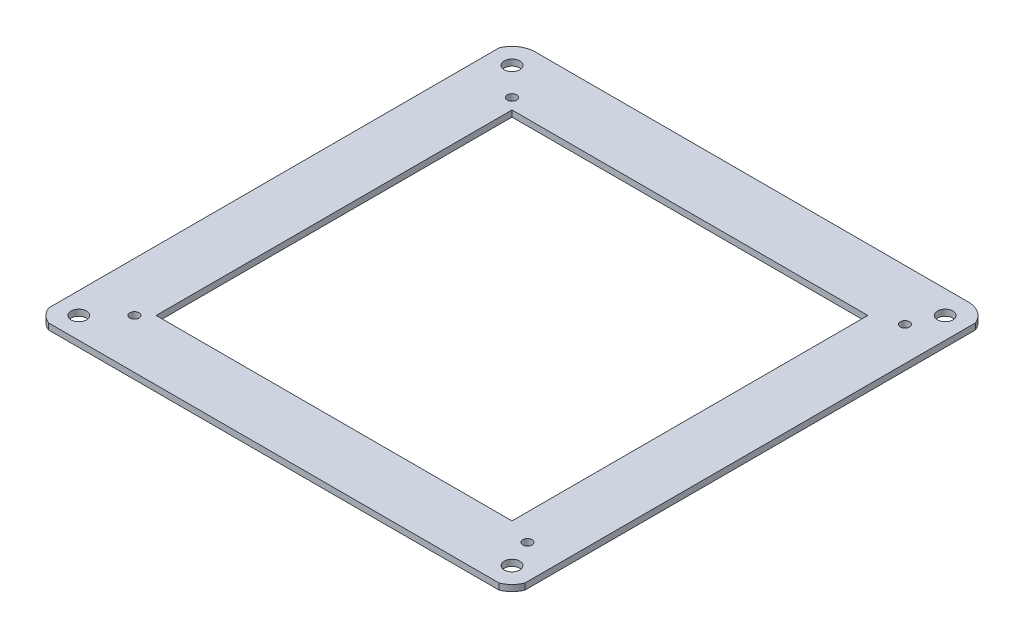
ISO-10303-21;
HEADER;
FILE_DESCRIPTION(('STEP AP214'),'2;1');
FILE_NAME('part.step','',(''),(''),'','','');
FILE_SCHEMA(('AUTOMOTIVE_DESIGN { 1 0 10303 214 1 1 1 1 }'));
ENDSEC;
DATA;
#1=APPLICATION_CONTEXT('core data for automotive mechanical design processes');
#2=APPLICATION_PROTOCOL_DEFINITION('international standard','automotive_design',2000,#1);
#3=PRODUCT_CONTEXT('',#1,'mechanical');
#4=PRODUCT('Part','Part','',(#3));
#5=PRODUCT_RELATED_PRODUCT_CATEGORY('part','',(#4));
#6=PRODUCT_DEFINITION_FORMATION('','',#4);
#7=PRODUCT_DEFINITION_CONTEXT('part definition',#1,'design');
#8=PRODUCT_DEFINITION('design','',#6,#7);
#9=PRODUCT_DEFINITION_SHAPE('','',#8);
#10=(LENGTH_UNIT() NAMED_UNIT(*) SI_UNIT(.MILLI.,.METRE.));
#11=(NAMED_UNIT(*) PLANE_ANGLE_UNIT() SI_UNIT($,.RADIAN.));
#12=(NAMED_UNIT(*) SI_UNIT($,.STERADIAN.) SOLID_ANGLE_UNIT());
#13=UNCERTAINTY_MEASURE_WITH_UNIT(LENGTH_MEASURE(1.E-05),#10,'distance_accuracy_value','');
#14=(GEOMETRIC_REPRESENTATION_CONTEXT(3) GLOBAL_UNCERTAINTY_ASSIGNED_CONTEXT((#13)) GLOBAL_UNIT_ASSIGNED_CONTEXT((#10,
#11,#12)) REPRESENTATION_CONTEXT('',''));
#15=CARTESIAN_POINT('',(0.,0.,0.));
#16=DIRECTION('',(0.,0.,1.));
#17=DIRECTION('',(1.,0.,0.));
#18=AXIS2_PLACEMENT_3D('',#15,#16,#17);
#19=CARTESIAN_POINT('',(0.,2.,0.));
#20=DIRECTION('',(0.,1.,0.));
#21=DIRECTION('',(0.,0.,1.));
#22=AXIS2_PLACEMENT_3D('',#19,#20,#21);
#23=PLANE('',#22);
#24=DIRECTION('',(0.,0.,-1.));
#25=VECTOR('',#24,1.);
#26=CARTESIAN_POINT('',(57.5000000000001,2.,0.));
#27=LINE('',#26,#25);
#28=CARTESIAN_POINT('',(57.5000000000001,2.,57.5000000000001));
#29=VERTEX_POINT('',#28);
#30=CARTESIAN_POINT('',(57.5000000000001,2.,-57.4999999999998));
#31=VERTEX_POINT('',#30);
#32=EDGE_CURVE('E197',#29,#31,#27,.T.);
#33=ORIENTED_EDGE('',*,*,#32,.F.);
#34=DIRECTION('',(1.,0.,0.));
#35=VECTOR('',#34,1.);
#36=CARTESIAN_POINT('',(0.,2.,57.5000000000001));
#37=LINE('',#36,#35);
#38=CARTESIAN_POINT('',(-57.4999999999999,2.,57.5000000000001));
#39=VERTEX_POINT('',#38);
#40=EDGE_CURVE('E200',#39,#29,#37,.T.);
#41=ORIENTED_EDGE('',*,*,#40,.F.);
#42=DIRECTION('',(0.,0.,-1.));
#43=VECTOR('',#42,1.);
#44=CARTESIAN_POINT('',(-57.4999999999999,2.,0.));
#45=LINE('',#44,#43);
#46=CARTESIAN_POINT('',(-57.4999999999999,2.,-57.4999999999998));
#47=VERTEX_POINT('',#46);
#48=EDGE_CURVE('E203',#39,#47,#45,.T.);
#49=ORIENTED_EDGE('',*,*,#48,.T.);
#50=DIRECTION('',(1.,0.,0.));
#51=VECTOR('',#50,1.);
#52=CARTESIAN_POINT('',(0.,2.,-57.4999999999998));
#53=LINE('',#52,#51);
#54=EDGE_CURVE('E206',#47,#31,#53,.T.);
#55=ORIENTED_EDGE('',*,*,#54,.T.);
#56=EDGE_LOOP('',(#33,#41,#49,#55));
#57=FACE_BOUND('',#56,.T.);
#58=CARTESIAN_POINT('',(-70.,2.,-69.9999999999999));
#59=DIRECTION('',(0.,1.,0.));
#60=DIRECTION('',(0.,0.,1.));
#61=AXIS2_PLACEMENT_3D('',#58,#59,#60);
#62=CIRCLE('',#61,2.5);
#63=CARTESIAN_POINT('',(-70.,2.,-67.4999999999999));
#64=VERTEX_POINT('',#63);
#65=EDGE_CURVE('E194',#64,#64,#62,.T.);
#66=ORIENTED_EDGE('',*,*,#65,.F.);
#67=EDGE_LOOP('',(#66));
#68=FACE_BOUND('',#67,.T.);
#69=CARTESIAN_POINT('',(70.,2.,-69.9999999999999));
#70=DIRECTION('',(0.,1.,0.));
#71=DIRECTION('',(0.,0.,1.));
#72=AXIS2_PLACEMENT_3D('',#69,#70,#71);
#73=CIRCLE('',#72,2.5);
#74=CARTESIAN_POINT('',(70.,2.,-67.4999999999999));
#75=VERTEX_POINT('',#74);
#76=EDGE_CURVE('E191',#75,#75,#73,.T.);
#77=ORIENTED_EDGE('',*,*,#76,.F.);
#78=EDGE_LOOP('',(#77));
#79=FACE_BOUND('',#78,.T.);
#80=CARTESIAN_POINT('',(70.,2.,70.0000000000001));
#81=DIRECTION('',(0.,1.,0.));
#82=DIRECTION('',(0.,0.,1.));
#83=AXIS2_PLACEMENT_3D('',#80,#81,#82);
#84=CIRCLE('',#83,2.5);
#85=CARTESIAN_POINT('',(70.,2.,72.5000000000001));
#86=VERTEX_POINT('',#85);
#87=EDGE_CURVE('E188',#86,#86,#84,.T.);
#88=ORIENTED_EDGE('',*,*,#87,.F.);
#89=EDGE_LOOP('',(#88));
#90=FACE_BOUND('',#89,.T.);
#91=CARTESIAN_POINT('',(-70.,2.,70.0000000000001));
#92=DIRECTION('',(0.,1.,0.));
#93=DIRECTION('',(0.,0.,1.));
#94=AXIS2_PLACEMENT_3D('',#91,#92,#93);
#95=CIRCLE('',#94,2.50000000000001);
#96=CARTESIAN_POINT('',(-70.,2.,72.5000000000001));
#97=VERTEX_POINT('',#96);
#98=EDGE_CURVE('E185',#97,#97,#95,.T.);
#99=ORIENTED_EDGE('',*,*,#98,.F.);
#100=EDGE_LOOP('',(#99));
#101=FACE_BOUND('',#100,.T.);
#102=CARTESIAN_POINT('',(-61.,2.,-61.));
#103=DIRECTION('',(0.,1.,0.));
#104=DIRECTION('',(0.,0.,1.));
#105=AXIS2_PLACEMENT_3D('',#102,#103,#104);
#106=CIRCLE('',#105,1.5);
#107=CARTESIAN_POINT('',(-61.,2.,-59.5));
#108=VERTEX_POINT('',#107);
#109=EDGE_CURVE('E182',#108,#108,#106,.T.);
#110=ORIENTED_EDGE('',*,*,#109,.F.);
#111=EDGE_LOOP('',(#110));
#112=FACE_BOUND('',#111,.T.);
#113=CARTESIAN_POINT('',(66.,2.,-61.));
#114=DIRECTION('',(0.,1.,0.));
#115=DIRECTION('',(0.,0.,1.));
#116=AXIS2_PLACEMENT_3D('',#113,#114,#115);
#117=CIRCLE('',#116,1.5);
#118=CARTESIAN_POINT('',(66.,2.,-59.5));
#119=VERTEX_POINT('',#118);
#120=EDGE_CURVE('E179',#119,#119,#117,.T.);
#121=ORIENTED_EDGE('',*,*,#120,.F.);
#122=EDGE_LOOP('',(#121));
#123=FACE_BOUND('',#122,.T.);
#124=CARTESIAN_POINT('',(66.,2.,61.));
#125=DIRECTION('',(0.,1.,0.));
#126=DIRECTION('',(0.,0.,1.));
#127=AXIS2_PLACEMENT_3D('',#124,#125,#126);
#128=CIRCLE('',#127,1.5);
#129=CARTESIAN_POINT('',(66.,2.,62.5));
#130=VERTEX_POINT('',#129);
#131=EDGE_CURVE('E175',#130,#130,#128,.T.);
#132=ORIENTED_EDGE('',*,*,#131,.F.);
#133=EDGE_LOOP('',(#132));
#134=FACE_BOUND('',#133,.T.);
#135=CARTESIAN_POINT('',(-61.,2.,61.0000000000001));
#136=DIRECTION('',(0.,1.,0.));
#137=DIRECTION('',(0.,0.,1.));
#138=AXIS2_PLACEMENT_3D('',#135,#136,#137);
#139=CIRCLE('',#138,1.5);
#140=CARTESIAN_POINT('',(-61.,2.,62.5000000000001));
#141=VERTEX_POINT('',#140);
#142=EDGE_CURVE('E172',#141,#141,#139,.T.);
#143=ORIENTED_EDGE('',*,*,#142,.F.);
#144=EDGE_LOOP('',(#143));
#145=FACE_BOUND('',#144,.T.);
#146=DIRECTION('',(0.,0.,-1.));
#147=VECTOR('',#146,1.);
#148=CARTESIAN_POINT('',(76.9635751816395,2.,72.7854300726558));
#149=LINE('',#148,#147);
#150=CARTESIAN_POINT('',(76.9635751816395,2.,72.7854300726558));
#151=VERTEX_POINT('',#150);
#152=CARTESIAN_POINT('',(76.9635751816395,2.,-72.7854300726557));
#153=VERTEX_POINT('',#152);
#154=EDGE_CURVE('E158',#151,#153,#149,.T.);
#155=ORIENTED_EDGE('',*,*,#154,.T.);
#156=CARTESIAN_POINT('',(70.,2.,-69.9999999999999));
#157=DIRECTION('',(0.,1.,0.));
#158=DIRECTION('',(0.,0.,1.));
#159=AXIS2_PLACEMENT_3D('',#156,#157,#158);
#160=CIRCLE('',#159,7.50000000000001);
#161=CARTESIAN_POINT('',(70.,2.,-77.5));
#162=VERTEX_POINT('',#161);
#163=EDGE_CURVE('E147',#153,#162,#160,.T.);
#164=ORIENTED_EDGE('',*,*,#163,.T.);
#165=DIRECTION('',(-1.,0.,0.));
#166=VECTOR('',#165,1.);
#167=CARTESIAN_POINT('',(70.,2.,-77.5));
#168=LINE('',#167,#166);
#169=CARTESIAN_POINT('',(-70.,2.,-77.5));
#170=VERTEX_POINT('',#169);
#171=EDGE_CURVE('E145',#162,#170,#168,.T.);
#172=ORIENTED_EDGE('',*,*,#171,.T.);
#173=CARTESIAN_POINT('',(-70.,2.,-69.9999999999999));
#174=DIRECTION('',(0.,1.,0.));
#175=DIRECTION('',(0.,0.,1.));
#176=AXIS2_PLACEMENT_3D('',#173,#174,#175);
#177=CIRCLE('',#176,7.50000000000001);
#178=CARTESIAN_POINT('',(-76.9635751816394,2.,-72.7854300726556));
#179=VERTEX_POINT('',#178);
#180=EDGE_CURVE('E51',#170,#179,#177,.T.);
#181=ORIENTED_EDGE('',*,*,#180,.T.);
#182=DIRECTION('',(0.,0.,1.));
#183=VECTOR('',#182,1.);
#184=CARTESIAN_POINT('',(-76.9635751816394,2.,72.7854300726558));
#185=LINE('',#184,#183);
#186=CARTESIAN_POINT('',(-76.9635751816394,2.,72.7854300726558));
#187=VERTEX_POINT('',#186);
#188=EDGE_CURVE('E134',#179,#187,#185,.T.);
#189=ORIENTED_EDGE('',*,*,#188,.T.);
#190=CARTESIAN_POINT('',(-70.,2.,70.0000000000001));
#191=DIRECTION('',(0.,1.,0.));
#192=DIRECTION('',(0.,0.,1.));
#193=AXIS2_PLACEMENT_3D('',#190,#191,#192);
#194=CIRCLE('',#193,7.5);
#195=CARTESIAN_POINT('',(-72.7854300726558,2.,76.9635751816395));
#196=VERTEX_POINT('',#195);
#197=EDGE_CURVE('E140',#187,#196,#194,.T.);
#198=ORIENTED_EDGE('',*,*,#197,.T.);
#199=DIRECTION('',(1.,0.,0.));
#200=VECTOR('',#199,1.);
#201=CARTESIAN_POINT('',(72.7854300726559,2.,76.9635751816395));
#202=LINE('',#201,#200);
#203=CARTESIAN_POINT('',(72.7854300726559,2.,76.9635751816395));
#204=VERTEX_POINT('',#203);
#205=EDGE_CURVE('E152',#196,#204,#202,.T.);
#206=ORIENTED_EDGE('',*,*,#205,.T.);
#207=CARTESIAN_POINT('',(70.,2.,70.0000000000001));
#208=DIRECTION('',(0.,1.,0.));
#209=DIRECTION('',(0.,0.,1.));
#210=AXIS2_PLACEMENT_3D('',#207,#208,#209);
#211=CIRCLE('',#210,7.5);
#212=EDGE_CURVE('E155',#204,#151,#211,.T.);
#213=ORIENTED_EDGE('',*,*,#212,.T.);
#214=EDGE_LOOP('',(#155,#164,#172,#181,#189,#198,#206,#213));
#215=FACE_BOUND('',#214,.T.);
#216=ADVANCED_FACE('F36',(#57,#68,#79,#90,#101,#112,#123,#134,#145,#215),#23,.T.);
#217=CARTESIAN_POINT('',(0.,0.,0.));
#218=DIRECTION('',(0.,1.,0.));
#219=DIRECTION('',(0.,0.,1.));
#220=AXIS2_PLACEMENT_3D('',#217,#218,#219);
#221=PLANE('',#220);
#222=DIRECTION('',(0.,0.,-1.));
#223=VECTOR('',#222,1.);
#224=CARTESIAN_POINT('',(57.5000000000001,0.,0.));
#225=LINE('',#224,#223);
#226=CARTESIAN_POINT('',(57.5000000000001,0.,57.5000000000001));
#227=VERTEX_POINT('',#226);
#228=CARTESIAN_POINT('',(57.5000000000001,0.,-57.4999999999998));
#229=VERTEX_POINT('',#228);
#230=EDGE_CURVE('E232',#227,#229,#225,.T.);
#231=ORIENTED_EDGE('',*,*,#230,.T.);
#232=DIRECTION('',(1.,0.,0.));
#233=VECTOR('',#232,1.);
#234=CARTESIAN_POINT('',(0.,0.,-57.4999999999998));
#235=LINE('',#234,#233);
#236=CARTESIAN_POINT('',(-57.4999999999999,0.,-57.4999999999998));
#237=VERTEX_POINT('',#236);
#238=EDGE_CURVE('E176',#237,#229,#235,.T.);
#239=ORIENTED_EDGE('',*,*,#238,.F.);
#240=DIRECTION('',(0.,0.,-1.));
#241=VECTOR('',#240,1.);
#242=CARTESIAN_POINT('',(-57.4999999999999,0.,0.));
#243=LINE('',#242,#241);
#244=CARTESIAN_POINT('',(-57.4999999999999,0.,57.5000000000001));
#245=VERTEX_POINT('',#244);
#246=EDGE_CURVE('E238',#245,#237,#243,.T.);
#247=ORIENTED_EDGE('',*,*,#246,.F.);
#248=DIRECTION('',(1.,0.,0.));
#249=VECTOR('',#248,1.);
#250=CARTESIAN_POINT('',(0.,0.,57.5000000000001));
#251=LINE('',#250,#249);
#252=EDGE_CURVE('E235',#245,#227,#251,.T.);
#253=ORIENTED_EDGE('',*,*,#252,.T.);
#254=EDGE_LOOP('',(#231,#239,#247,#253));
#255=FACE_BOUND('',#254,.T.);
#256=CARTESIAN_POINT('',(-70.,0.,-69.9999999999999));
#257=DIRECTION('',(0.,1.,0.));
#258=DIRECTION('',(0.,0.,1.));
#259=AXIS2_PLACEMENT_3D('',#256,#257,#258);
#260=CIRCLE('',#259,2.5);
#261=CARTESIAN_POINT('',(-70.,0.,-67.4999999999999));
#262=VERTEX_POINT('',#261);
#263=EDGE_CURVE('E229',#262,#262,#260,.T.);
#264=ORIENTED_EDGE('',*,*,#263,.T.);
#265=EDGE_LOOP('',(#264));
#266=FACE_BOUND('',#265,.T.);
#267=CARTESIAN_POINT('',(70.,0.,-69.9999999999999));
#268=DIRECTION('',(0.,1.,0.));
#269=DIRECTION('',(0.,0.,1.));
#270=AXIS2_PLACEMENT_3D('',#267,#268,#269);
#271=CIRCLE('',#270,2.5);
#272=CARTESIAN_POINT('',(70.,0.,-67.4999999999999));
#273=VERTEX_POINT('',#272);
#274=EDGE_CURVE('E226',#273,#273,#271,.T.);
#275=ORIENTED_EDGE('',*,*,#274,.T.);
#276=EDGE_LOOP('',(#275));
#277=FACE_BOUND('',#276,.T.);
#278=CARTESIAN_POINT('',(70.,0.,70.0000000000001));
#279=DIRECTION('',(0.,1.,0.));
#280=DIRECTION('',(0.,0.,1.));
#281=AXIS2_PLACEMENT_3D('',#278,#279,#280);
#282=CIRCLE('',#281,2.5);
#283=CARTESIAN_POINT('',(70.,0.,72.5000000000001));
#284=VERTEX_POINT('',#283);
#285=EDGE_CURVE('E223',#284,#284,#282,.T.);
#286=ORIENTED_EDGE('',*,*,#285,.T.);
#287=EDGE_LOOP('',(#286));
#288=FACE_BOUND('',#287,.T.);
#289=CARTESIAN_POINT('',(-70.,0.,70.0000000000001));
#290=DIRECTION('',(0.,1.,0.));
#291=DIRECTION('',(0.,0.,1.));
#292=AXIS2_PLACEMENT_3D('',#289,#290,#291);
#293=CIRCLE('',#292,2.50000000000001);
#294=CARTESIAN_POINT('',(-70.,0.,72.5000000000001));
#295=VERTEX_POINT('',#294);
#296=EDGE_CURVE('E220',#295,#295,#293,.T.);
#297=ORIENTED_EDGE('',*,*,#296,.T.);
#298=EDGE_LOOP('',(#297));
#299=FACE_BOUND('',#298,.T.);
#300=CARTESIAN_POINT('',(-61.,0.,-61.));
#301=DIRECTION('',(0.,1.,0.));
#302=DIRECTION('',(0.,0.,1.));
#303=AXIS2_PLACEMENT_3D('',#300,#301,#302);
#304=CIRCLE('',#303,1.5);
#305=CARTESIAN_POINT('',(-61.,0.,-59.5));
#306=VERTEX_POINT('',#305);
#307=EDGE_CURVE('E217',#306,#306,#304,.T.);
#308=ORIENTED_EDGE('',*,*,#307,.T.);
#309=EDGE_LOOP('',(#308));
#310=FACE_BOUND('',#309,.T.);
#311=CARTESIAN_POINT('',(66.,0.,-61.));
#312=DIRECTION('',(0.,1.,0.));
#313=DIRECTION('',(0.,0.,1.));
#314=AXIS2_PLACEMENT_3D('',#311,#312,#313);
#315=CIRCLE('',#314,1.5);
#316=CARTESIAN_POINT('',(66.,0.,-59.5));
#317=VERTEX_POINT('',#316);
#318=EDGE_CURVE('E214',#317,#317,#315,.T.);
#319=ORIENTED_EDGE('',*,*,#318,.T.);
#320=EDGE_LOOP('',(#319));
#321=FACE_BOUND('',#320,.T.);
#322=CARTESIAN_POINT('',(66.,0.,61.));
#323=DIRECTION('',(0.,1.,0.));
#324=DIRECTION('',(0.,0.,1.));
#325=AXIS2_PLACEMENT_3D('',#322,#323,#324);
#326=CIRCLE('',#325,1.5);
#327=CARTESIAN_POINT('',(66.,0.,62.5));
#328=VERTEX_POINT('',#327);
#329=EDGE_CURVE('E211',#328,#328,#326,.T.);
#330=ORIENTED_EDGE('',*,*,#329,.T.);
#331=EDGE_LOOP('',(#330));
#332=FACE_BOUND('',#331,.T.);
#333=CARTESIAN_POINT('',(-61.,0.,61.0000000000001));
#334=DIRECTION('',(0.,1.,0.));
#335=DIRECTION('',(0.,0.,1.));
#336=AXIS2_PLACEMENT_3D('',#333,#334,#335);
#337=CIRCLE('',#336,1.5);
#338=CARTESIAN_POINT('',(-61.,0.,62.5000000000001));
#339=VERTEX_POINT('',#338);
#340=EDGE_CURVE('E162',#339,#339,#337,.T.);
#341=ORIENTED_EDGE('',*,*,#340,.T.);
#342=EDGE_LOOP('',(#341));
#343=FACE_BOUND('',#342,.T.);
#344=CARTESIAN_POINT('',(70.,0.,-69.9999999999999));
#345=DIRECTION('',(0.,1.,0.));
#346=DIRECTION('',(0.,0.,1.));
#347=AXIS2_PLACEMENT_3D('',#344,#345,#346);
#348=CIRCLE('',#347,7.50000000000001);
#349=CARTESIAN_POINT('',(76.9635751816395,0.,-72.7854300726557));
#350=VERTEX_POINT('',#349);
#351=CARTESIAN_POINT('',(70.,0.,-77.5));
#352=VERTEX_POINT('',#351);
#353=EDGE_CURVE('E11',#350,#352,#348,.T.);
#354=ORIENTED_EDGE('',*,*,#353,.F.);
#355=DIRECTION('',(0.,0.,-1.));
#356=VECTOR('',#355,1.);
#357=CARTESIAN_POINT('',(76.9635751816395,0.,0.));
#358=LINE('',#357,#356);
#359=CARTESIAN_POINT('',(76.9635751816395,0.,72.7854300726558));
#360=VERTEX_POINT('',#359);
#361=EDGE_CURVE('E44',#360,#350,#358,.T.);
#362=ORIENTED_EDGE('',*,*,#361,.F.);
#363=CARTESIAN_POINT('',(70.,0.,70.0000000000001));
#364=DIRECTION('',(0.,1.,0.));
#365=DIRECTION('',(0.,0.,1.));
#366=AXIS2_PLACEMENT_3D('',#363,#364,#365);
#367=CIRCLE('',#366,7.5);
#368=CARTESIAN_POINT('',(72.7854300726559,0.,76.9635751816395));
#369=VERTEX_POINT('',#368);
#370=EDGE_CURVE('E260',#369,#360,#367,.T.);
#371=ORIENTED_EDGE('',*,*,#370,.F.);
#372=DIRECTION('',(1.,0.,0.));
#373=VECTOR('',#372,1.);
#374=CARTESIAN_POINT('',(0.,0.,76.9635751816395));
#375=LINE('',#374,#373);
#376=CARTESIAN_POINT('',(-72.7854300726558,0.,76.9635751816395));
#377=VERTEX_POINT('',#376);
#378=EDGE_CURVE('E258',#377,#369,#375,.T.);
#379=ORIENTED_EDGE('',*,*,#378,.F.);
#380=CARTESIAN_POINT('',(-70.,0.,70.0000000000001));
#381=DIRECTION('',(0.,1.,0.));
#382=DIRECTION('',(0.,0.,1.));
#383=AXIS2_PLACEMENT_3D('',#380,#381,#382);
#384=CIRCLE('',#383,7.5);
#385=CARTESIAN_POINT('',(-76.9635751816394,0.,72.7854300726558));
#386=VERTEX_POINT('',#385);
#387=EDGE_CURVE('E256',#386,#377,#384,.T.);
#388=ORIENTED_EDGE('',*,*,#387,.F.);
#389=DIRECTION('',(0.,0.,1.));
#390=VECTOR('',#389,1.);
#391=CARTESIAN_POINT('',(-76.9635751816394,0.,0.));
#392=LINE('',#391,#390);
#393=CARTESIAN_POINT('',(-76.9635751816394,0.,-72.7854300726556));
#394=VERTEX_POINT('',#393);
#395=EDGE_CURVE('E254',#394,#386,#392,.T.);
#396=ORIENTED_EDGE('',*,*,#395,.F.);
#397=CARTESIAN_POINT('',(-70.,0.,-69.9999999999999));
#398=DIRECTION('',(0.,1.,0.));
#399=DIRECTION('',(0.,0.,1.));
#400=AXIS2_PLACEMENT_3D('',#397,#398,#399);
#401=CIRCLE('',#400,7.50000000000001);
#402=CARTESIAN_POINT('',(-70.,0.,-77.5));
#403=VERTEX_POINT('',#402);
#404=EDGE_CURVE('E127',#403,#394,#401,.T.);
#405=ORIENTED_EDGE('',*,*,#404,.F.);
#406=DIRECTION('',(-1.,0.,0.));
#407=VECTOR('',#406,1.);
#408=CARTESIAN_POINT('',(0.,0.,-77.5));
#409=LINE('',#408,#407);
#410=EDGE_CURVE('E251',#352,#403,#409,.T.);
#411=ORIENTED_EDGE('',*,*,#410,.F.);
#412=EDGE_LOOP('',(#354,#362,#371,#379,#388,#396,#405,#411));
#413=FACE_BOUND('',#412,.T.);
#414=ADVANCED_FACE('F274',(#255,#266,#277,#288,#299,#310,#321,#332,#343,#413),#221,.F.);
#415=CARTESIAN_POINT('',(57.5000000000001,2.,0.));
#416=DIRECTION('',(-1.,0.,0.));
#417=DIRECTION('',(0.,0.,1.));
#418=AXIS2_PLACEMENT_3D('',#415,#416,#417);
#419=PLANE('',#418);
#420=ORIENTED_EDGE('',*,*,#230,.F.);
#421=DIRECTION('',(0.,-1.,0.));
#422=VECTOR('',#421,1.);
#423=CARTESIAN_POINT('',(57.5000000000001,2.,57.5000000000001));
#424=LINE('',#423,#422);
#425=EDGE_CURVE('E249',#29,#227,#424,.T.);
#426=ORIENTED_EDGE('',*,*,#425,.F.);
#427=ORIENTED_EDGE('',*,*,#32,.T.);
#428=DIRECTION('',(0.,-1.,0.));
#429=VECTOR('',#428,1.);
#430=CARTESIAN_POINT('',(57.5000000000001,2.,-57.4999999999998));
#431=LINE('',#430,#429);
#432=EDGE_CURVE('E208',#31,#229,#431,.T.);
#433=ORIENTED_EDGE('',*,*,#432,.T.);
#434=EDGE_LOOP('',(#420,#426,#427,#433));
#435=FACE_BOUND('',#434,.T.);
#436=ADVANCED_FACE('F302',(#435),#419,.T.);
#437=CARTESIAN_POINT('',(0.,2.,57.5000000000001));
#438=DIRECTION('',(0.,0.,-1.));
#439=DIRECTION('',(-1.,0.,0.));
#440=AXIS2_PLACEMENT_3D('',#437,#438,#439);
#441=PLANE('',#440);
#442=ORIENTED_EDGE('',*,*,#252,.F.);
#443=DIRECTION('',(0.,-1.,0.));
#444=VECTOR('',#443,1.);
#445=CARTESIAN_POINT('',(-57.4999999999999,2.,57.5000000000001));
#446=LINE('',#445,#444);
#447=EDGE_CURVE('E247',#39,#245,#446,.T.);
#448=ORIENTED_EDGE('',*,*,#447,.F.);
#449=ORIENTED_EDGE('',*,*,#40,.T.);
#450=ORIENTED_EDGE('',*,*,#425,.T.);
#451=EDGE_LOOP('',(#442,#448,#449,#450));
#452=FACE_BOUND('',#451,.T.);
#453=ADVANCED_FACE('F318',(#452),#441,.T.);
#454=CARTESIAN_POINT('',(-57.4999999999999,2.,0.));
#455=DIRECTION('',(-1.,0.,0.));
#456=DIRECTION('',(0.,0.,1.));
#457=AXIS2_PLACEMENT_3D('',#454,#455,#456);
#458=PLANE('',#457);
#459=ORIENTED_EDGE('',*,*,#246,.T.);
#460=DIRECTION('',(0.,-1.,0.));
#461=VECTOR('',#460,1.);
#462=CARTESIAN_POINT('',(-57.4999999999999,2.,-57.4999999999998));
#463=LINE('',#462,#461);
#464=EDGE_CURVE('E244',#47,#237,#463,.T.);
#465=ORIENTED_EDGE('',*,*,#464,.F.);
#466=ORIENTED_EDGE('',*,*,#48,.F.);
#467=ORIENTED_EDGE('',*,*,#447,.T.);
#468=EDGE_LOOP('',(#459,#465,#466,#467));
#469=FACE_BOUND('',#468,.T.);
#470=ADVANCED_FACE('F314',(#469),#458,.F.);
#471=CARTESIAN_POINT('',(0.,2.,-57.4999999999998));
#472=DIRECTION('',(0.,0.,-1.));
#473=DIRECTION('',(-1.,0.,0.));
#474=AXIS2_PLACEMENT_3D('',#471,#472,#473);
#475=PLANE('',#474);
#476=ORIENTED_EDGE('',*,*,#238,.T.);
#477=ORIENTED_EDGE('',*,*,#432,.F.);
#478=ORIENTED_EDGE('',*,*,#54,.F.);
#479=ORIENTED_EDGE('',*,*,#464,.T.);
#480=EDGE_LOOP('',(#476,#477,#478,#479));
#481=FACE_BOUND('',#480,.T.);
#482=ADVANCED_FACE('F310',(#481),#475,.F.);
#483=CARTESIAN_POINT('',(-70.,2.,-69.9999999999999));
#484=DIRECTION('',(0.,-1.,0.));
#485=DIRECTION('',(0.,0.,-1.));
#486=AXIS2_PLACEMENT_3D('',#483,#484,#485);
#487=CYLINDRICAL_SURFACE('',#486,2.5);
#488=ORIENTED_EDGE('',*,*,#65,.T.);
#489=EDGE_LOOP('',(#488));
#490=FACE_BOUND('',#489,.T.);
#491=ORIENTED_EDGE('',*,*,#263,.F.);
#492=EDGE_LOOP('',(#491));
#493=FACE_BOUND('',#492,.T.);
#494=ADVANCED_FACE('F313',(#490,#493),#487,.F.);
#495=CARTESIAN_POINT('',(70.,2.,-69.9999999999999));
#496=DIRECTION('',(0.,-1.,0.));
#497=DIRECTION('',(0.,0.,-1.));
#498=AXIS2_PLACEMENT_3D('',#495,#496,#497);
#499=CYLINDRICAL_SURFACE('',#498,2.5);
#500=ORIENTED_EDGE('',*,*,#76,.T.);
#501=EDGE_LOOP('',(#500));
#502=FACE_BOUND('',#501,.T.);
#503=ORIENTED_EDGE('',*,*,#274,.F.);
#504=EDGE_LOOP('',(#503));
#505=FACE_BOUND('',#504,.T.);
#506=ADVANCED_FACE('F328',(#502,#505),#499,.F.);
#507=CARTESIAN_POINT('',(70.,2.,70.0000000000001));
#508=DIRECTION('',(0.,-1.,0.));
#509=DIRECTION('',(0.,0.,-1.));
#510=AXIS2_PLACEMENT_3D('',#507,#508,#509);
#511=CYLINDRICAL_SURFACE('',#510,2.5);
#512=ORIENTED_EDGE('',*,*,#87,.T.);
#513=EDGE_LOOP('',(#512));
#514=FACE_BOUND('',#513,.T.);
#515=ORIENTED_EDGE('',*,*,#285,.F.);
#516=EDGE_LOOP('',(#515));
#517=FACE_BOUND('',#516,.T.);
#518=ADVANCED_FACE('F332',(#514,#517),#511,.F.);
#519=CARTESIAN_POINT('',(-70.,2.,70.0000000000001));
#520=DIRECTION('',(0.,-1.,0.));
#521=DIRECTION('',(0.,0.,-1.));
#522=AXIS2_PLACEMENT_3D('',#519,#520,#521);
#523=CYLINDRICAL_SURFACE('',#522,2.50000000000001);
#524=ORIENTED_EDGE('',*,*,#98,.T.);
#525=EDGE_LOOP('',(#524));
#526=FACE_BOUND('',#525,.T.);
#527=ORIENTED_EDGE('',*,*,#296,.F.);
#528=EDGE_LOOP('',(#527));
#529=FACE_BOUND('',#528,.T.);
#530=ADVANCED_FACE('F336',(#526,#529),#523,.F.);
#531=CARTESIAN_POINT('',(-61.,2.,-61.));
#532=DIRECTION('',(0.,-1.,0.));
#533=DIRECTION('',(0.,0.,-1.));
#534=AXIS2_PLACEMENT_3D('',#531,#532,#533);
#535=CYLINDRICAL_SURFACE('',#534,1.5);
#536=ORIENTED_EDGE('',*,*,#109,.T.);
#537=EDGE_LOOP('',(#536));
#538=FACE_BOUND('',#537,.T.);
#539=ORIENTED_EDGE('',*,*,#307,.F.);
#540=EDGE_LOOP('',(#539));
#541=FACE_BOUND('',#540,.T.);
#542=ADVANCED_FACE('F340',(#538,#541),#535,.F.);
#543=CARTESIAN_POINT('',(66.,2.,-61.));
#544=DIRECTION('',(0.,-1.,0.));
#545=DIRECTION('',(0.,0.,-1.));
#546=AXIS2_PLACEMENT_3D('',#543,#544,#545);
#547=CYLINDRICAL_SURFACE('',#546,1.5);
#548=ORIENTED_EDGE('',*,*,#120,.T.);
#549=EDGE_LOOP('',(#548));
#550=FACE_BOUND('',#549,.T.);
#551=ORIENTED_EDGE('',*,*,#318,.F.);
#552=EDGE_LOOP('',(#551));
#553=FACE_BOUND('',#552,.T.);
#554=ADVANCED_FACE('F344',(#550,#553),#547,.F.);
#555=CARTESIAN_POINT('',(66.,2.,61.));
#556=DIRECTION('',(0.,-1.,0.));
#557=DIRECTION('',(0.,0.,-1.));
#558=AXIS2_PLACEMENT_3D('',#555,#556,#557);
#559=CYLINDRICAL_SURFACE('',#558,1.5);
#560=ORIENTED_EDGE('',*,*,#131,.T.);
#561=EDGE_LOOP('',(#560));
#562=FACE_BOUND('',#561,.T.);
#563=ORIENTED_EDGE('',*,*,#329,.F.);
#564=EDGE_LOOP('',(#563));
#565=FACE_BOUND('',#564,.T.);
#566=ADVANCED_FACE('F347',(#562,#565),#559,.F.);
#567=CARTESIAN_POINT('',(-61.,2.,61.0000000000001));
#568=DIRECTION('',(0.,-1.,0.));
#569=DIRECTION('',(0.,0.,-1.));
#570=AXIS2_PLACEMENT_3D('',#567,#568,#569);
#571=CYLINDRICAL_SURFACE('',#570,1.5);
#572=ORIENTED_EDGE('',*,*,#142,.T.);
#573=EDGE_LOOP('',(#572));
#574=FACE_BOUND('',#573,.T.);
#575=ORIENTED_EDGE('',*,*,#340,.F.);
#576=EDGE_LOOP('',(#575));
#577=FACE_BOUND('',#576,.T.);
#578=ADVANCED_FACE('F38',(#574,#577),#571,.F.);
#579=CARTESIAN_POINT('',(70.,-8.,-69.9999999999999));
#580=DIRECTION('',(0.,1.,0.));
#581=DIRECTION('',(0.,0.,1.));
#582=AXIS2_PLACEMENT_3D('',#579,#580,#581);
#583=CYLINDRICAL_SURFACE('',#582,7.50000000000001);
#584=ORIENTED_EDGE('',*,*,#353,.T.);
#585=DIRECTION('',(0.,1.,0.));
#586=VECTOR('',#585,1.);
#587=CARTESIAN_POINT('',(70.,-8.,-77.5));
#588=LINE('',#587,#586);
#589=EDGE_CURVE('E59',#352,#162,#588,.T.);
#590=ORIENTED_EDGE('',*,*,#589,.T.);
#591=ORIENTED_EDGE('',*,*,#163,.F.);
#592=DIRECTION('',(0.,1.,0.));
#593=VECTOR('',#592,1.);
#594=CARTESIAN_POINT('',(76.9635751816395,-8.,-72.7854300726557));
#595=LINE('',#594,#593);
#596=EDGE_CURVE('E160',#350,#153,#595,.T.);
#597=ORIENTED_EDGE('',*,*,#596,.F.);
#598=EDGE_LOOP('',(#584,#590,#591,#597));
#599=FACE_BOUND('',#598,.T.);
#600=ADVANCED_FACE('F272',(#599),#583,.T.);
#601=CARTESIAN_POINT('',(76.9635751816395,-8.,72.7854300726558));
#602=DIRECTION('',(1.,0.,0.));
#603=DIRECTION('',(0.,0.,-1.));
#604=AXIS2_PLACEMENT_3D('',#601,#602,#603);
#605=PLANE('',#604);
#606=ORIENTED_EDGE('',*,*,#361,.T.);
#607=ORIENTED_EDGE('',*,*,#596,.T.);
#608=ORIENTED_EDGE('',*,*,#154,.F.);
#609=DIRECTION('',(0.,1.,0.));
#610=VECTOR('',#609,1.);
#611=CARTESIAN_POINT('',(76.9635751816395,-8.,72.7854300726558));
#612=LINE('',#611,#610);
#613=EDGE_CURVE('E163',#360,#151,#612,.T.);
#614=ORIENTED_EDGE('',*,*,#613,.F.);
#615=EDGE_LOOP('',(#606,#607,#608,#614));
#616=FACE_BOUND('',#615,.T.);
#617=ADVANCED_FACE('F265',(#616),#605,.T.);
#618=CARTESIAN_POINT('',(70.,-8.,70.0000000000001));
#619=DIRECTION('',(0.,1.,0.));
#620=DIRECTION('',(0.,0.,1.));
#621=AXIS2_PLACEMENT_3D('',#618,#619,#620);
#622=CYLINDRICAL_SURFACE('',#621,7.5);
#623=ORIENTED_EDGE('',*,*,#370,.T.);
#624=ORIENTED_EDGE('',*,*,#613,.T.);
#625=ORIENTED_EDGE('',*,*,#212,.F.);
#626=DIRECTION('',(0.,1.,0.));
#627=VECTOR('',#626,1.);
#628=CARTESIAN_POINT('',(72.7854300726559,-8.,76.9635751816395));
#629=LINE('',#628,#627);
#630=EDGE_CURVE('E165',#369,#204,#629,.T.);
#631=ORIENTED_EDGE('',*,*,#630,.F.);
#632=EDGE_LOOP('',(#623,#624,#625,#631));
#633=FACE_BOUND('',#632,.T.);
#634=ADVANCED_FACE('F280',(#633),#622,.T.);
#635=CARTESIAN_POINT('',(72.7854300726559,-8.,76.9635751816395));
#636=DIRECTION('',(0.,0.,1.));
#637=DIRECTION('',(1.,0.,0.));
#638=AXIS2_PLACEMENT_3D('',#635,#636,#637);
#639=PLANE('',#638);
#640=ORIENTED_EDGE('',*,*,#378,.T.);
#641=ORIENTED_EDGE('',*,*,#630,.T.);
#642=ORIENTED_EDGE('',*,*,#205,.F.);
#643=DIRECTION('',(0.,1.,0.));
#644=VECTOR('',#643,1.);
#645=CARTESIAN_POINT('',(-72.7854300726558,-8.,76.9635751816395));
#646=LINE('',#645,#644);
#647=EDGE_CURVE('E167',#377,#196,#646,.T.);
#648=ORIENTED_EDGE('',*,*,#647,.F.);
#649=EDGE_LOOP('',(#640,#641,#642,#648));
#650=FACE_BOUND('',#649,.T.);
#651=ADVANCED_FACE('F285',(#650),#639,.T.);
#652=CARTESIAN_POINT('',(-70.,-8.,70.0000000000001));
#653=DIRECTION('',(0.,1.,0.));
#654=DIRECTION('',(0.,0.,1.));
#655=AXIS2_PLACEMENT_3D('',#652,#653,#654);
#656=CYLINDRICAL_SURFACE('',#655,7.5);
#657=ORIENTED_EDGE('',*,*,#387,.T.);
#658=ORIENTED_EDGE('',*,*,#647,.T.);
#659=ORIENTED_EDGE('',*,*,#197,.F.);
#660=DIRECTION('',(0.,1.,0.));
#661=VECTOR('',#660,1.);
#662=CARTESIAN_POINT('',(-76.9635751816394,-8.,72.7854300726558));
#663=LINE('',#662,#661);
#664=EDGE_CURVE('E130',#386,#187,#663,.T.);
#665=ORIENTED_EDGE('',*,*,#664,.F.);
#666=EDGE_LOOP('',(#657,#658,#659,#665));
#667=FACE_BOUND('',#666,.T.);
#668=ADVANCED_FACE('F287',(#667),#656,.T.);
#669=CARTESIAN_POINT('',(-76.9635751816394,-8.,72.7854300726558));
#670=DIRECTION('',(-1.,0.,0.));
#671=DIRECTION('',(0.,0.,1.));
#672=AXIS2_PLACEMENT_3D('',#669,#670,#671);
#673=PLANE('',#672);
#674=ORIENTED_EDGE('',*,*,#395,.T.);
#675=ORIENTED_EDGE('',*,*,#664,.T.);
#676=ORIENTED_EDGE('',*,*,#188,.F.);
#677=DIRECTION('',(0.,1.,0.));
#678=VECTOR('',#677,1.);
#679=CARTESIAN_POINT('',(-76.9635751816394,-8.,-72.7854300726556));
#680=LINE('',#679,#678);
#681=EDGE_CURVE('E123',#394,#179,#680,.T.);
#682=ORIENTED_EDGE('',*,*,#681,.F.);
#683=EDGE_LOOP('',(#674,#675,#676,#682));
#684=FACE_BOUND('',#683,.T.);
#685=ADVANCED_FACE('F135',(#684),#673,.T.);
#686=CARTESIAN_POINT('',(-70.,-8.,-69.9999999999999));
#687=DIRECTION('',(0.,1.,0.));
#688=DIRECTION('',(0.,0.,1.));
#689=AXIS2_PLACEMENT_3D('',#686,#687,#688);
#690=CYLINDRICAL_SURFACE('',#689,7.50000000000001);
#691=ORIENTED_EDGE('',*,*,#404,.T.);
#692=ORIENTED_EDGE('',*,*,#681,.T.);
#693=ORIENTED_EDGE('',*,*,#180,.F.);
#694=DIRECTION('',(0.,1.,0.));
#695=VECTOR('',#694,1.);
#696=CARTESIAN_POINT('',(-70.,-8.,-77.5));
#697=LINE('',#696,#695);
#698=EDGE_CURVE('E131',#403,#170,#697,.T.);
#699=ORIENTED_EDGE('',*,*,#698,.F.);
#700=EDGE_LOOP('',(#691,#692,#693,#699));
#701=FACE_BOUND('',#700,.T.);
#702=ADVANCED_FACE('F125',(#701),#690,.T.);
#703=CARTESIAN_POINT('',(70.,-8.,-77.5));
#704=DIRECTION('',(0.,0.,-1.));
#705=DIRECTION('',(-1.,0.,0.));
#706=AXIS2_PLACEMENT_3D('',#703,#704,#705);
#707=PLANE('',#706);
#708=ORIENTED_EDGE('',*,*,#410,.T.);
#709=ORIENTED_EDGE('',*,*,#698,.T.);
#710=ORIENTED_EDGE('',*,*,#171,.F.);
#711=ORIENTED_EDGE('',*,*,#589,.F.);
#712=EDGE_LOOP('',(#708,#709,#710,#711));
#713=FACE_BOUND('',#712,.T.);
#714=ADVANCED_FACE('F275',(#713),#707,.T.);
#715=CLOSED_SHELL('',(#216,#414,#436,#453,#470,#482,#494,#506,#518,#530,#542,#554,#566,#578,
#600,#617,#634,#651,#668,#685,#702,#714));
#716=MANIFOLD_SOLID_BREP('B2',#715);
#717=ADVANCED_BREP_SHAPE_REPRESENTATION('',(#18,#716),#14);
#718=SHAPE_DEFINITION_REPRESENTATION(#9,#717);
ENDSEC;
END-ISO-10303-21;
